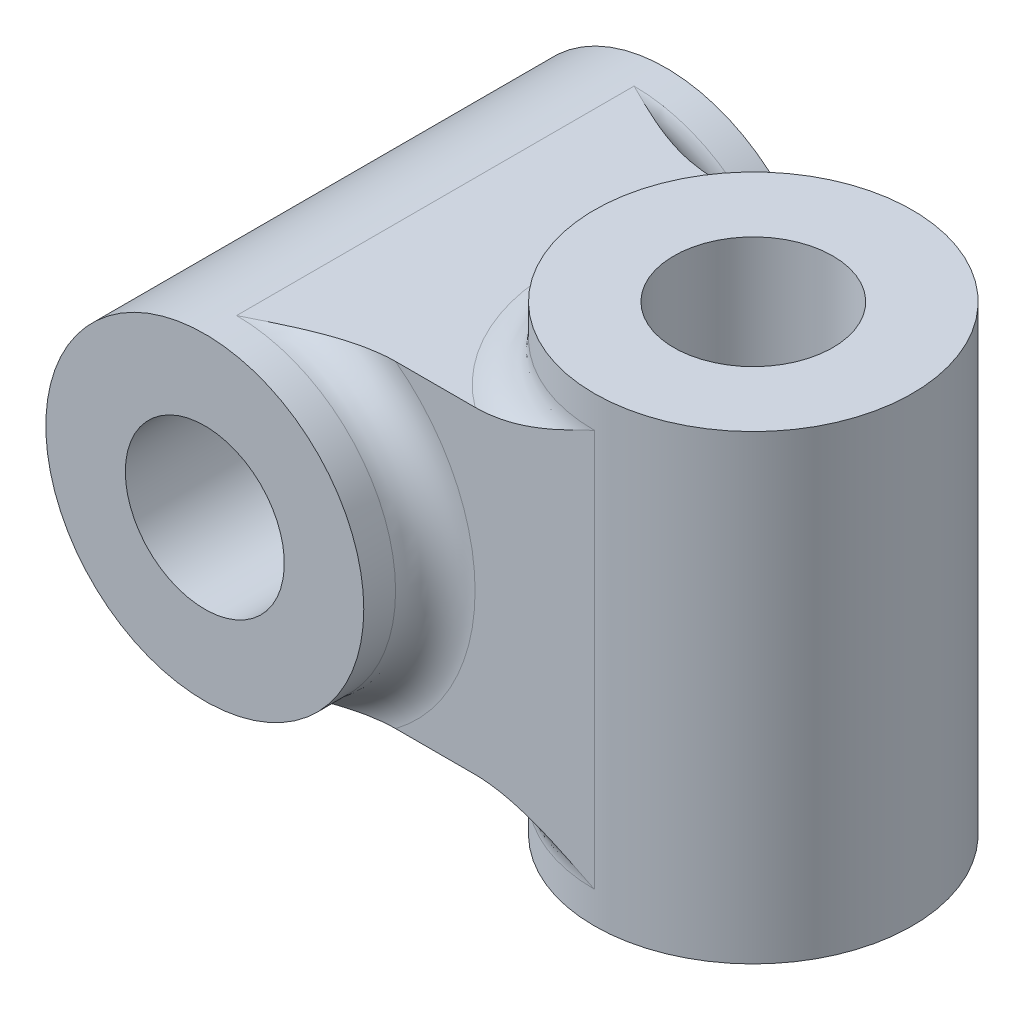
ISO-10303-21;
HEADER;
FILE_DESCRIPTION(('STEP AP214'),'2;1');
FILE_NAME('part.step','',(''),(''),'','','');
FILE_SCHEMA(('AUTOMOTIVE_DESIGN { 1 0 10303 214 1 1 1 1 }'));
ENDSEC;
DATA;
#1=APPLICATION_CONTEXT('core data for automotive mechanical design processes');
#2=APPLICATION_PROTOCOL_DEFINITION('international standard','automotive_design',2000,#1);
#3=PRODUCT_CONTEXT('',#1,'mechanical');
#4=PRODUCT('Part','Part','',(#3));
#5=PRODUCT_RELATED_PRODUCT_CATEGORY('part','',(#4));
#6=PRODUCT_DEFINITION_FORMATION('','',#4);
#7=PRODUCT_DEFINITION_CONTEXT('part definition',#1,'design');
#8=PRODUCT_DEFINITION('design','',#6,#7);
#9=PRODUCT_DEFINITION_SHAPE('','',#8);
#10=(LENGTH_UNIT() NAMED_UNIT(*) SI_UNIT(.MILLI.,.METRE.));
#11=(NAMED_UNIT(*) PLANE_ANGLE_UNIT() SI_UNIT($,.RADIAN.));
#12=(NAMED_UNIT(*) SI_UNIT($,.STERADIAN.) SOLID_ANGLE_UNIT());
#13=UNCERTAINTY_MEASURE_WITH_UNIT(LENGTH_MEASURE(1.E-05),#10,'distance_accuracy_value','');
#14=(GEOMETRIC_REPRESENTATION_CONTEXT(3) GLOBAL_UNCERTAINTY_ASSIGNED_CONTEXT((#13)) GLOBAL_UNIT_ASSIGNED_CONTEXT((#10,
#11,#12)) REPRESENTATION_CONTEXT('',''));
#15=CARTESIAN_POINT('',(0.,0.,0.));
#16=DIRECTION('',(0.,0.,1.));
#17=DIRECTION('',(1.,0.,0.));
#18=AXIS2_PLACEMENT_3D('',#15,#16,#17);
#19=CARTESIAN_POINT('',(0.,0.,58.));
#20=DIRECTION('',(0.,0.,1.));
#21=DIRECTION('',(1.,0.,0.));
#22=AXIS2_PLACEMENT_3D('',#19,#20,#21);
#23=PLANE('',#22);
#24=CARTESIAN_POINT('',(0.,0.,58.));
#25=DIRECTION('',(0.,0.,1.));
#26=DIRECTION('',(1.,0.,0.));
#27=AXIS2_PLACEMENT_3D('',#24,#25,#26);
#28=CIRCLE('',#27,20.);
#29=CARTESIAN_POINT('',(20.,0.,58.));
#30=VERTEX_POINT('',#29);
#31=EDGE_CURVE('E127',#30,#30,#28,.T.);
#32=ORIENTED_EDGE('',*,*,#31,.T.);
#33=EDGE_LOOP('',(#32));
#34=FACE_BOUND('',#33,.T.);
#35=CARTESIAN_POINT('',(0.,0.,58.));
#36=DIRECTION('',(0.,0.,1.));
#37=DIRECTION('',(1.,0.,0.));
#38=AXIS2_PLACEMENT_3D('',#35,#36,#37);
#39=CIRCLE('',#38,10.);
#40=CARTESIAN_POINT('',(-10.,0.,58.));
#41=VERTEX_POINT('',#40);
#42=EDGE_CURVE('E231',#41,#41,#39,.T.);
#43=ORIENTED_EDGE('',*,*,#42,.F.);
#44=EDGE_LOOP('',(#43));
#45=FACE_BOUND('',#44,.T.);
#46=ADVANCED_FACE('F41',(#34,#45),#23,.T.);
#47=CARTESIAN_POINT('',(0.,0.,0.));
#48=DIRECTION('',(0.,0.,1.));
#49=DIRECTION('',(1.,0.,0.));
#50=AXIS2_PLACEMENT_3D('',#47,#48,#49);
#51=PLANE('',#50);
#52=CARTESIAN_POINT('',(0.,0.,0.));
#53=DIRECTION('',(0.,0.,1.));
#54=DIRECTION('',(1.,0.,0.));
#55=AXIS2_PLACEMENT_3D('',#52,#53,#54);
#56=CIRCLE('',#55,20.);
#57=CARTESIAN_POINT('',(20.,0.,0.));
#58=VERTEX_POINT('',#57);
#59=EDGE_CURVE('E228',#58,#58,#56,.T.);
#60=ORIENTED_EDGE('',*,*,#59,.F.);
#61=EDGE_LOOP('',(#60));
#62=FACE_BOUND('',#61,.T.);
#63=CARTESIAN_POINT('',(0.,0.,0.));
#64=DIRECTION('',(0.,0.,1.));
#65=DIRECTION('',(1.,0.,0.));
#66=AXIS2_PLACEMENT_3D('',#63,#64,#65);
#67=CIRCLE('',#66,10.);
#68=CARTESIAN_POINT('',(-10.,0.,0.));
#69=VERTEX_POINT('',#68);
#70=EDGE_CURVE('E234',#69,#69,#67,.T.);
#71=ORIENTED_EDGE('',*,*,#70,.T.);
#72=EDGE_LOOP('',(#71));
#73=FACE_BOUND('',#72,.T.);
#74=ADVANCED_FACE('F279',(#62,#73),#51,.F.);
#75=CARTESIAN_POINT('',(0.,0.,58.));
#76=DIRECTION('',(0.,0.,-1.));
#77=DIRECTION('',(-1.,0.,0.));
#78=AXIS2_PLACEMENT_3D('',#75,#76,#77);
#79=CYLINDRICAL_SURFACE('',#78,20.);
#80=DIRECTION('',(0.,0.,-1.));
#81=VECTOR('',#80,1.);
#82=CARTESIAN_POINT('',(0.,20.,49.));
#83=LINE('',#82,#81);
#84=CARTESIAN_POINT('',(0.,20.,54.));
#85=VERTEX_POINT('',#84);
#86=CARTESIAN_POINT('',(0.,20.,3.99999999999999));
#87=VERTEX_POINT('',#86);
#88=EDGE_CURVE('E209',#85,#87,#83,.T.);
#89=ORIENTED_EDGE('',*,*,#88,.T.);
#90=CARTESIAN_POINT('',(0.,0.,3.99999999999998));
#91=DIRECTION('',(0.,0.,1.));
#92=DIRECTION('',(0.,-1.,0.));
#93=AXIS2_PLACEMENT_3D('',#90,#91,#92);
#94=CIRCLE('',#93,20.);
#95=CARTESIAN_POINT('',(0.,-20.,3.99999999999998));
#96=VERTEX_POINT('',#95);
#97=EDGE_CURVE('E216',#87,#96,#94,.F.);
#98=ORIENTED_EDGE('',*,*,#97,.T.);
#99=DIRECTION('',(0.,0.,-1.));
#100=VECTOR('',#99,1.);
#101=CARTESIAN_POINT('',(0.,-20.,49.));
#102=LINE('',#101,#100);
#103=CARTESIAN_POINT('',(0.,-20.,54.));
#104=VERTEX_POINT('',#103);
#105=EDGE_CURVE('E119',#104,#96,#102,.T.);
#106=ORIENTED_EDGE('',*,*,#105,.F.);
#107=CARTESIAN_POINT('',(0.,0.,54.));
#108=DIRECTION('',(0.,0.,1.));
#109=DIRECTION('',(1.,0.,0.));
#110=AXIS2_PLACEMENT_3D('',#107,#108,#109);
#111=CIRCLE('',#110,20.);
#112=EDGE_CURVE('E218',#104,#85,#111,.T.);
#113=ORIENTED_EDGE('',*,*,#112,.T.);
#114=EDGE_LOOP('',(#89,#98,#106,#113));
#115=FACE_BOUND('',#114,.T.);
#116=ORIENTED_EDGE('',*,*,#31,.F.);
#117=EDGE_LOOP('',(#116));
#118=FACE_BOUND('',#117,.T.);
#119=ORIENTED_EDGE('',*,*,#59,.T.);
#120=EDGE_LOOP('',(#119));
#121=FACE_BOUND('',#120,.T.);
#122=ADVANCED_FACE('F285',(#115,#118,#121),#79,.T.);
#123=CARTESIAN_POINT('',(0.,0.,58.));
#124=DIRECTION('',(0.,0.,-1.));
#125=DIRECTION('',(-1.,0.,0.));
#126=AXIS2_PLACEMENT_3D('',#123,#124,#125);
#127=CYLINDRICAL_SURFACE('',#126,10.);
#128=CARTESIAN_POINT('',(-10.,0.,58.));
#129=CARTESIAN_POINT('',(-10.,0.,57.3958333333333));
#130=CARTESIAN_POINT('',(-10.,0.,56.7916666666667));
#131=CARTESIAN_POINT('',(-10.,0.,55.5833333333333));
#132=CARTESIAN_POINT('',(-10.,0.,54.9791666666667));
#133=CARTESIAN_POINT('',(-10.,0.,53.7708333333333));
#134=CARTESIAN_POINT('',(-10.,0.,53.1666666666667));
#135=CARTESIAN_POINT('',(-10.,0.,51.9583333333333));
#136=CARTESIAN_POINT('',(-10.,0.,51.3541666666667));
#137=CARTESIAN_POINT('',(-10.,0.,50.1458333333333));
#138=CARTESIAN_POINT('',(-10.,0.,49.5416666666667));
#139=CARTESIAN_POINT('',(-10.,0.,48.3333333333333));
#140=CARTESIAN_POINT('',(-10.,0.,47.7291666666667));
#141=CARTESIAN_POINT('',(-10.,0.,46.5208333333333));
#142=CARTESIAN_POINT('',(-10.,0.,45.9166666666667));
#143=CARTESIAN_POINT('',(-10.,0.,44.7083333333333));
#144=CARTESIAN_POINT('',(-10.,0.,44.1041666666667));
#145=CARTESIAN_POINT('',(-10.,0.,42.8958333333333));
#146=CARTESIAN_POINT('',(-10.,0.,42.2916666666667));
#147=CARTESIAN_POINT('',(-10.,0.,41.0833333333333));
#148=CARTESIAN_POINT('',(-10.,0.,40.4791666666667));
#149=CARTESIAN_POINT('',(-10.,0.,39.2708333333333));
#150=CARTESIAN_POINT('',(-10.,0.,38.6666666666667));
#151=CARTESIAN_POINT('',(-10.,0.,37.4583333333333));
#152=CARTESIAN_POINT('',(-10.,0.,36.8541666666667));
#153=CARTESIAN_POINT('',(-10.,0.,35.6458333333333));
#154=CARTESIAN_POINT('',(-10.,0.,35.0416666666667));
#155=CARTESIAN_POINT('',(-10.,0.,33.8333333333333));
#156=CARTESIAN_POINT('',(-10.,0.,33.2291666666667));
#157=CARTESIAN_POINT('',(-10.,0.,32.0208333333333));
#158=CARTESIAN_POINT('',(-10.,0.,31.4166666666667));
#159=CARTESIAN_POINT('',(-10.,0.,30.2083333333333));
#160=CARTESIAN_POINT('',(-10.,0.,29.6041666666667));
#161=CARTESIAN_POINT('',(-10.,0.,28.3958333333333));
#162=CARTESIAN_POINT('',(-10.,0.,27.7916666666667));
#163=CARTESIAN_POINT('',(-10.,0.,26.5833333333333));
#164=CARTESIAN_POINT('',(-10.,0.,25.9791666666667));
#165=CARTESIAN_POINT('',(-10.,0.,24.7708333333333));
#166=CARTESIAN_POINT('',(-10.,0.,24.1666666666667));
#167=CARTESIAN_POINT('',(-10.,0.,22.9583333333333));
#168=CARTESIAN_POINT('',(-10.,0.,22.3541666666667));
#169=CARTESIAN_POINT('',(-10.,0.,21.1458333333333));
#170=CARTESIAN_POINT('',(-10.,0.,20.5416666666667));
#171=CARTESIAN_POINT('',(-10.,0.,19.3333333333333));
#172=CARTESIAN_POINT('',(-10.,0.,18.7291666666667));
#173=CARTESIAN_POINT('',(-10.,0.,17.5208333333333));
#174=CARTESIAN_POINT('',(-10.,0.,16.9166666666667));
#175=CARTESIAN_POINT('',(-10.,0.,15.7083333333333));
#176=CARTESIAN_POINT('',(-10.,0.,15.1041666666667));
#177=CARTESIAN_POINT('',(-10.,0.,13.8958333333333));
#178=CARTESIAN_POINT('',(-10.,0.,13.2916666666667));
#179=CARTESIAN_POINT('',(-10.,0.,12.0833333333333));
#180=CARTESIAN_POINT('',(-10.,0.,11.4791666666667));
#181=CARTESIAN_POINT('',(-10.,0.,10.2708333333333));
#182=CARTESIAN_POINT('',(-10.,0.,9.66666666666667));
#183=CARTESIAN_POINT('',(-10.,0.,8.45833333333333));
#184=CARTESIAN_POINT('',(-10.,0.,7.85416666666667));
#185=CARTESIAN_POINT('',(-10.,0.,6.64583333333333));
#186=CARTESIAN_POINT('',(-10.,0.,6.04166666666667));
#187=CARTESIAN_POINT('',(-10.,0.,4.83333333333333));
#188=CARTESIAN_POINT('',(-10.,0.,4.22916666666667));
#189=CARTESIAN_POINT('',(-10.,0.,3.02083333333334));
#190=CARTESIAN_POINT('',(-10.,0.,2.41666666666667));
#191=CARTESIAN_POINT('',(-10.,0.,1.20833333333333));
#192=CARTESIAN_POINT('',(-10.,0.,0.604166666666666));
#193=CARTESIAN_POINT('',(-10.,0.,0.));
#194=B_SPLINE_CURVE_WITH_KNOTS('',3,(#128,#129,#130,#131,#132,#133,#134,#135,#136,#137,#138,
#139,#140,#141,#142,#143,#144,#145,#146,#147,#148,#149,#150,#151,#152,#153,#154,#155,#156,#157,
#158,#159,#160,#161,#162,#163,#164,#165,#166,#167,#168,#169,#170,#171,#172,#173,#174,#175,#176,
#177,#178,#179,#180,#181,#182,#183,#184,#185,#186,#187,#188,#189,#190,#191,#192,#193),
.UNSPECIFIED.,.F.,.F.,(4,2,2,2,2,2,2,2,2,2,2,2,2,2,2,2,2,2,2,2,2,2,2,2,2,2,2,2,2,2,2,2,4),(0.,
1.81249999999999,3.625,5.4375,7.24999999999999,9.06249999999999,10.875,12.6875,14.5,16.3125,
18.125,19.9375,21.75,23.5625,25.375,27.1875,29.,30.8125,32.625,34.4375,36.25,38.0625,39.875,
41.6875,43.5,45.3125,47.125,48.9375,50.75,52.5625,54.375,56.1875,58.),.UNSPECIFIED.);
#195=EDGE_CURVE('BSEAM289',#41,#69,#194,.T.);
#196=ORIENTED_EDGE('',*,*,#42,.T.);
#197=ORIENTED_EDGE('',*,*,#70,.F.);
#198=ORIENTED_EDGE('',*,*,#195,.T.);
#199=ORIENTED_EDGE('',*,*,#195,.F.);
#200=EDGE_LOOP('',(#196,#198,#197,#199));
#201=FACE_BOUND('',#200,.T.);
#202=ADVANCED_FACE('F289',(#201),#127,.F.);
#203=CARTESIAN_POINT('',(40.,-20.,49.));
#204=DIRECTION('',(0.,0.,1.));
#205=DIRECTION('',(1.,0.,0.));
#206=AXIS2_PLACEMENT_3D('',#203,#204,#205);
#207=PLANE('',#206);
#208=DIRECTION('',(-1.,0.,0.));
#209=VECTOR('',#208,1.);
#210=CARTESIAN_POINT('',(40.,20.,49.));
#211=LINE('',#210,#209);
#212=CARTESIAN_POINT('',(25.,20.,49.));
#213=VERTEX_POINT('',#212);
#214=CARTESIAN_POINT('',(15.,20.,49.));
#215=VERTEX_POINT('',#214);
#216=EDGE_CURVE('E240',#213,#215,#211,.T.);
#217=ORIENTED_EDGE('',*,*,#216,.T.);
#218=CARTESIAN_POINT('',(0.,0.,49.));
#219=DIRECTION('',(0.,0.,1.));
#220=DIRECTION('',(1.,0.,0.));
#221=AXIS2_PLACEMENT_3D('',#218,#219,#220);
#222=CIRCLE('',#221,25.);
#223=CARTESIAN_POINT('',(15.,-20.,49.));
#224=VERTEX_POINT('',#223);
#225=EDGE_CURVE('E200',#215,#224,#222,.F.);
#226=ORIENTED_EDGE('',*,*,#225,.T.);
#227=DIRECTION('',(-1.,0.,0.));
#228=VECTOR('',#227,1.);
#229=CARTESIAN_POINT('',(40.,-20.,49.));
#230=LINE('',#229,#228);
#231=CARTESIAN_POINT('',(25.,-20.,49.));
#232=VERTEX_POINT('',#231);
#233=EDGE_CURVE('E237',#232,#224,#230,.T.);
#234=ORIENTED_EDGE('',*,*,#233,.F.);
#235=CARTESIAN_POINT('',(25.,-20.,49.));
#236=CARTESIAN_POINT('',(25.2651282089429,-20.0000248440085,49.));
#237=CARTESIAN_POINT('',(25.5301771044987,-20.007589934337,49.));
#238=CARTESIAN_POINT('',(26.0593880846254,-20.0364294351582,49.));
#239=CARTESIAN_POINT('',(26.3235505882963,-20.0576960351639,49.));
#240=CARTESIAN_POINT('',(26.8497890843893,-20.1124898408836,49.));
#241=CARTESIAN_POINT('',(27.1118689280912,-20.145980810748,49.));
#242=CARTESIAN_POINT('',(27.6343923106904,-20.2240499150372,49.));
#243=CARTESIAN_POINT('',(27.8948355873029,-20.2686297823921,49.));
#244=CARTESIAN_POINT('',(28.6664609884388,-20.4160433975464,49.));
#245=CARTESIAN_POINT('',(29.1749087512093,-20.5333381947335,49.));
#246=CARTESIAN_POINT('',(30.1837126611257,-20.7995778005164,49.));
#247=CARTESIAN_POINT('',(30.6840614597819,-20.9485497892506,49.));
#248=CARTESIAN_POINT('',(31.5605831445864,-21.2342047748402,49.));
#249=CARTESIAN_POINT('',(31.9384874405667,-21.3656435859749,49.));
#250=CARTESIAN_POINT('',(32.6897037488905,-21.6410837307938,49.));
#251=CARTESIAN_POINT('',(33.0630153714214,-21.7850861225578,49.));
#252=CARTESIAN_POINT('',(34.176661641421,-22.2325984737774,49.));
#253=CARTESIAN_POINT('',(34.9107431272673,-22.5516256043198,49.));
#254=CARTESIAN_POINT('',(36.3696325965115,-23.216950662706,49.));
#255=CARTESIAN_POINT('',(37.0943930587858,-23.5633504064254,49.));
#256=CARTESIAN_POINT('',(38.5376845637521,-24.2689287241272,49.));
#257=CARTESIAN_POINT('',(39.2562150092713,-24.6281085066499,49.));
#258=CARTESIAN_POINT('',(39.9831345201157,-24.9915672610964,49.));
#259=CARTESIAN_POINT('',(39.9915672605557,-24.9957836313378,49.));
#260=CARTESIAN_POINT('',(40.,-25.,49.));
#261=B_SPLINE_CURVE_WITH_KNOTS('',3,(#235,#236,#237,#238,#239,#240,#241,#242,#243,#244,#245,
#246,#247,#248,#249,#250,#251,#252,#253,#254,#255,#256,#257,#258,#259,#260),.UNSPECIFIED.,.F.,
.F.,(4,2,2,2,2,2,2,2,2,2,2,2,4),(0.,0.795162748327174,1.58987261810577,2.38224566558403,
3.17474261995516,4.73875375654246,6.30411232391702,7.50419539676254,8.70437963595933,
11.1046360659497,13.5142837354925,15.9241598813816,15.952444152629),.UNSPECIFIED.);
#262=CARTESIAN_POINT('',(40.,-25.,49.));
#263=VERTEX_POINT('',#262);
#264=EDGE_CURVE('E114',#232,#263,#261,.T.);
#265=ORIENTED_EDGE('',*,*,#264,.T.);
#266=DIRECTION('',(0.,1.,0.));
#267=VECTOR('',#266,1.);
#268=CARTESIAN_POINT('',(40.,-20.,49.));
#269=LINE('',#268,#267);
#270=CARTESIAN_POINT('',(40.,25.,49.));
#271=VERTEX_POINT('',#270);
#272=EDGE_CURVE('E109',#263,#271,#269,.T.);
#273=ORIENTED_EDGE('',*,*,#272,.T.);
#274=CARTESIAN_POINT('',(25.,20.,49.));
#275=CARTESIAN_POINT('',(25.2651282089429,20.0000248440085,49.));
#276=CARTESIAN_POINT('',(25.5301771044987,20.007589934337,49.));
#277=CARTESIAN_POINT('',(26.0593880846254,20.0364294351582,49.));
#278=CARTESIAN_POINT('',(26.3235505882963,20.0576960351639,49.));
#279=CARTESIAN_POINT('',(26.8497890843893,20.1124898408836,49.));
#280=CARTESIAN_POINT('',(27.1118689280912,20.145980810748,49.));
#281=CARTESIAN_POINT('',(27.6343923106904,20.2240499150372,49.));
#282=CARTESIAN_POINT('',(27.8948355873029,20.2686297823921,49.));
#283=CARTESIAN_POINT('',(28.6664609884388,20.4160433975464,49.));
#284=CARTESIAN_POINT('',(29.1749087512093,20.5333381947335,49.));
#285=CARTESIAN_POINT('',(30.1837126611257,20.7995778005164,49.));
#286=CARTESIAN_POINT('',(30.6840614597819,20.9485497892506,49.));
#287=CARTESIAN_POINT('',(31.5605831445864,21.2342047748402,49.));
#288=CARTESIAN_POINT('',(31.9384874405667,21.3656435859748,49.));
#289=CARTESIAN_POINT('',(32.6897037488905,21.6410837307938,49.));
#290=CARTESIAN_POINT('',(33.0630153714214,21.7850861225578,49.));
#291=CARTESIAN_POINT('',(34.176661641421,22.2325984737774,49.));
#292=CARTESIAN_POINT('',(34.9107431272673,22.5516256043198,49.));
#293=CARTESIAN_POINT('',(36.3696325965115,23.216950662706,49.));
#294=CARTESIAN_POINT('',(37.0943930587858,23.5633504064254,49.));
#295=CARTESIAN_POINT('',(38.5376845637521,24.2689287241272,49.));
#296=CARTESIAN_POINT('',(39.2562150092713,24.6281085066499,49.));
#297=CARTESIAN_POINT('',(39.9831345201157,24.9915672610964,49.));
#298=CARTESIAN_POINT('',(39.9915672605557,24.9957836313378,49.));
#299=CARTESIAN_POINT('',(40.,25.,49.));
#300=B_SPLINE_CURVE_WITH_KNOTS('',3,(#274,#275,#276,#277,#278,#279,#280,#281,#282,#283,#284,
#285,#286,#287,#288,#289,#290,#291,#292,#293,#294,#295,#296,#297,#298,#299),.UNSPECIFIED.,.F.,
.F.,(4,2,2,2,2,2,2,2,2,2,2,2,4),(0.,0.795162748327174,1.58987261810577,2.38224566558403,
3.17474261995516,4.73875375654246,6.30411232391702,7.50419539676255,8.70437963595933,
11.1046360659497,13.5142837354925,15.9241598813816,15.952444152629),.UNSPECIFIED.);
#301=EDGE_CURVE('E68',#271,#213,#300,.F.);
#302=ORIENTED_EDGE('',*,*,#301,.T.);
#303=EDGE_LOOP('',(#217,#226,#234,#265,#273,#302));
#304=FACE_BOUND('',#303,.T.);
#305=ADVANCED_FACE('F111',(#304),#207,.T.);
#306=CARTESIAN_POINT('',(40.,-20.,49.));
#307=DIRECTION('',(0.,1.,0.));
#308=DIRECTION('',(0.,0.,1.));
#309=AXIS2_PLACEMENT_3D('',#306,#307,#308);
#310=PLANE('',#309);
#311=DIRECTION('',(-1.,0.,0.));
#312=VECTOR('',#311,1.);
#313=CARTESIAN_POINT('',(40.,-20.,8.99999999999998));
#314=LINE('',#313,#312);
#315=CARTESIAN_POINT('',(25.,-20.,8.99999999999998));
#316=VERTEX_POINT('',#315);
#317=CARTESIAN_POINT('',(15.,-20.,8.99999999999998));
#318=VERTEX_POINT('',#317);
#319=EDGE_CURVE('E243',#316,#318,#314,.T.);
#320=ORIENTED_EDGE('',*,*,#319,.F.);
#321=CARTESIAN_POINT('',(40.,-20.,29.));
#322=DIRECTION('',(0.,1.,0.));
#323=DIRECTION('',(0.,0.,1.));
#324=AXIS2_PLACEMENT_3D('',#321,#322,#323);
#325=CIRCLE('',#324,25.);
#326=EDGE_CURVE('E225',#316,#232,#325,.T.);
#327=ORIENTED_EDGE('',*,*,#326,.T.);
#328=ORIENTED_EDGE('',*,*,#233,.T.);
#329=CARTESIAN_POINT('',(15.,-20.,49.));
#330=CARTESIAN_POINT('',(14.734871791058,-20.,49.0000248440085));
#331=CARTESIAN_POINT('',(14.4698228955031,-20.,49.007589934337));
#332=CARTESIAN_POINT('',(13.9406119153781,-20.,49.036429435158));
#333=CARTESIAN_POINT('',(13.6764494117081,-20.,49.0576960351635));
#334=CARTESIAN_POINT('',(13.1502109156166,-20.,49.1124898408829));
#335=CARTESIAN_POINT('',(12.8881310719155,-20.,49.1459808107472));
#336=CARTESIAN_POINT('',(12.3656076893176,-20.,49.2240499150359));
#337=CARTESIAN_POINT('',(12.1051644127057,-20.,49.2686297823906));
#338=CARTESIAN_POINT('',(11.3335390115688,-20.,49.4160433975447));
#339=CARTESIAN_POINT('',(10.8250912487966,-20.,49.533338194732));
#340=CARTESIAN_POINT('',(9.81628733887715,-20.,49.7995778005156));
#341=CARTESIAN_POINT('',(9.31593854021946,-20.,49.9485497892502));
#342=CARTESIAN_POINT('',(8.43941685541347,-20.,50.2342047748402));
#343=CARTESIAN_POINT('',(8.06151255943296,-20.,50.3656435859749));
#344=CARTESIAN_POINT('',(7.31029625110899,-20.,50.641083730794));
#345=CARTESIAN_POINT('',(6.9369846285781,-20.,50.7850861225583));
#346=CARTESIAN_POINT('',(5.82333835857747,-20.,51.2325984737775));
#347=CARTESIAN_POINT('',(5.08925687272968,-20.,51.5516256043185));
#348=CARTESIAN_POINT('',(3.63036740348735,-20.,52.2169506627092));
#349=CARTESIAN_POINT('',(2.90560694121646,-20.,52.5633504064345));
#350=CARTESIAN_POINT('',(1.46231543624279,-20.,53.2689287241194));
#351=CARTESIAN_POINT('',(0.74378499071274,-20.,53.6281085066193));
#352=CARTESIAN_POINT('',(0.0168654798839559,-20.,53.9915672610957));
#353=CARTESIAN_POINT('',(0.00843273944410271,-20.,53.9957836313375));
#354=CARTESIAN_POINT('',(0.,-20.,54.));
#355=B_SPLINE_CURVE_WITH_KNOTS('',3,(#329,#330,#331,#332,#333,#334,#335,#336,#337,#338,#339,
#340,#341,#342,#343,#344,#345,#346,#347,#348,#349,#350,#351,#352,#353,#354),.UNSPECIFIED.,.F.,
.F.,(4,2,2,2,2,2,2,2,2,2,2,2,4),(0.,0.795162748324529,1.58987261810048,2.38224566557666,
3.17474261994572,4.73875375653805,6.30411232391702,7.50419539676299,8.70437963596004,
11.1046360659524,13.5142837354942,15.9241598813816,15.952444152629),.UNSPECIFIED.);
#356=EDGE_CURVE('E12',#224,#104,#355,.T.);
#357=ORIENTED_EDGE('',*,*,#356,.T.);
#358=ORIENTED_EDGE('',*,*,#105,.T.);
#359=CARTESIAN_POINT('',(15.,-20.,8.99999999999998));
#360=CARTESIAN_POINT('',(14.7348717910581,-20.,8.99997515599151));
#361=CARTESIAN_POINT('',(14.4698228955031,-20.,8.99241006566299));
#362=CARTESIAN_POINT('',(13.9406119153783,-20.,8.96357056484199));
#363=CARTESIAN_POINT('',(13.6764494117083,-20.,8.94230396483651));
#364=CARTESIAN_POINT('',(13.1502109156169,-20.,8.88751015911715));
#365=CARTESIAN_POINT('',(12.8881310719158,-20.,8.85401918925287));
#366=CARTESIAN_POINT('',(12.3656076893179,-20.,8.77595008496414));
#367=CARTESIAN_POINT('',(12.1051644127061,-20.,8.73137021760948));
#368=CARTESIAN_POINT('',(11.3335390115692,-20.,8.58395660245538));
#369=CARTESIAN_POINT('',(10.8250912487969,-20.,8.46666180526804));
#370=CARTESIAN_POINT('',(9.81628733887729,-20.,8.20042219948441));
#371=CARTESIAN_POINT('',(9.31593854021953,-20.,8.0514502107498));
#372=CARTESIAN_POINT('',(8.43941685541347,-20.,7.76579522515975));
#373=CARTESIAN_POINT('',(8.06151255943294,-20.,7.63435641402509));
#374=CARTESIAN_POINT('',(7.31029625110897,-20.,7.35891626920594));
#375=CARTESIAN_POINT('',(6.93698462857808,-20.,7.2149138774417));
#376=CARTESIAN_POINT('',(5.8233383585774,-20.,6.76740152622248));
#377=CARTESIAN_POINT('',(5.08925687272954,-20.,6.4483743956816));
#378=CARTESIAN_POINT('',(3.6303674034873,-20.,5.78304933729061));
#379=CARTESIAN_POINT('',(2.90560694121658,-20.,5.43664959356502));
#380=CARTESIAN_POINT('',(1.46231543624254,-20.,4.73107127588095));
#381=CARTESIAN_POINT('',(0.743784990711952,-20.,4.37189149338223));
#382=CARTESIAN_POINT('',(0.016865479883942,-20.,4.00843273890429));
#383=CARTESIAN_POINT('',(0.00843273944409571,-20.,4.00421636866253));
#384=CARTESIAN_POINT('',(0.,-20.,3.99999999999998));
#385=B_SPLINE_CURVE_WITH_KNOTS('',3,(#359,#360,#361,#362,#363,#364,#365,#366,#367,#368,#369,
#370,#371,#372,#373,#374,#375,#376,#377,#378,#379,#380,#381,#382,#383,#384),.UNSPECIFIED.,.F.,
.F.,(4,2,2,2,2,2,2,2,2,2,2,2,4),(0.,0.795162748324397,1.58987261810021,2.3822456655763,
3.17474261994525,4.73875375653783,6.30411232391702,7.50419539676301,8.70437963596008,
11.1046360659526,13.5142837354943,15.9241598813816,15.952444152629),.UNSPECIFIED.);
#386=EDGE_CURVE('E135',#96,#318,#385,.F.);
#387=ORIENTED_EDGE('',*,*,#386,.T.);
#388=EDGE_LOOP('',(#320,#327,#328,#357,#358,#387));
#389=FACE_BOUND('',#388,.T.);
#390=ADVANCED_FACE('F179',(#389),#310,.F.);
#391=CARTESIAN_POINT('',(40.,-20.,8.99999999999998));
#392=DIRECTION('',(0.,0.,1.));
#393=DIRECTION('',(0.,-1.,0.));
#394=AXIS2_PLACEMENT_3D('',#391,#392,#393);
#395=PLANE('',#394);
#396=ORIENTED_EDGE('',*,*,#319,.T.);
#397=CARTESIAN_POINT('',(0.,0.,8.99999999999998));
#398=DIRECTION('',(0.,0.,1.));
#399=DIRECTION('',(0.,-1.,0.));
#400=AXIS2_PLACEMENT_3D('',#397,#398,#399);
#401=CIRCLE('',#400,25.);
#402=CARTESIAN_POINT('',(15.,20.,8.99999999999998));
#403=VERTEX_POINT('',#402);
#404=EDGE_CURVE('E221',#318,#403,#401,.T.);
#405=ORIENTED_EDGE('',*,*,#404,.T.);
#406=DIRECTION('',(-1.,0.,0.));
#407=VECTOR('',#406,1.);
#408=CARTESIAN_POINT('',(40.,20.,8.99999999999998));
#409=LINE('',#408,#407);
#410=CARTESIAN_POINT('',(25.,20.,8.99999999999998));
#411=VERTEX_POINT('',#410);
#412=EDGE_CURVE('E211',#411,#403,#409,.T.);
#413=ORIENTED_EDGE('',*,*,#412,.F.);
#414=CARTESIAN_POINT('',(25.,20.,8.99999999999998));
#415=CARTESIAN_POINT('',(25.265128208942,20.0000248440085,8.99999999999998));
#416=CARTESIAN_POINT('',(25.5301771044969,20.007589934337,8.99999999999998));
#417=CARTESIAN_POINT('',(26.0593880846219,20.036429435158,8.99999999999998));
#418=CARTESIAN_POINT('',(26.3235505882919,20.0576960351635,8.99999999999998));
#419=CARTESIAN_POINT('',(26.8497890843833,20.1124898408829,8.99999999999998));
#420=CARTESIAN_POINT('',(27.1118689280845,20.1459808107471,8.99999999999998));
#421=CARTESIAN_POINT('',(27.6343923106824,20.2240499150359,8.99999999999998));
#422=CARTESIAN_POINT('',(27.8948355872942,20.2686297823906,8.99999999999998));
#423=CARTESIAN_POINT('',(28.6664609884311,20.4160433975447,8.99999999999998));
#424=CARTESIAN_POINT('',(29.1749087512034,20.533338194732,8.99999999999998));
#425=CARTESIAN_POINT('',(30.1837126611228,20.7995778005156,8.99999999999998));
#426=CARTESIAN_POINT('',(30.6840614597805,20.9485497892502,8.99999999999998));
#427=CARTESIAN_POINT('',(31.5605831445865,21.2342047748402,8.99999999999998));
#428=CARTESIAN_POINT('',(31.9384874405671,21.3656435859749,8.99999999999998));
#429=CARTESIAN_POINT('',(32.689703748891,21.641083730794,8.99999999999998));
#430=CARTESIAN_POINT('',(33.0630153714219,21.7850861225583,8.99999999999998));
#431=CARTESIAN_POINT('',(34.1766616414226,22.2325984737775,8.99999999999998));
#432=CARTESIAN_POINT('',(34.9107431272704,22.5516256043184,8.99999999999998));
#433=CARTESIAN_POINT('',(36.3696325965127,23.2169506627093,8.99999999999998));
#434=CARTESIAN_POINT('',(37.0943930587835,23.5633504064346,8.99999999999998));
#435=CARTESIAN_POINT('',(38.5376845637573,24.2689287241193,8.99999999999998));
#436=CARTESIAN_POINT('',(39.2562150092874,24.6281085066189,8.99999999999998));
#437=CARTESIAN_POINT('',(39.983134520116,24.9915672610957,8.99999999999998));
#438=CARTESIAN_POINT('',(39.9915672605559,24.9957836313375,8.99999999999998));
#439=CARTESIAN_POINT('',(40.,25.,8.99999999999998));
#440=B_SPLINE_CURVE_WITH_KNOTS('',3,(#414,#415,#416,#417,#418,#419,#420,#421,#422,#423,#424,
#425,#426,#427,#428,#429,#430,#431,#432,#433,#434,#435,#436,#437,#438,#439),.UNSPECIFIED.,.F.,
.F.,(4,2,2,2,2,2,2,2,2,2,2,2,4),(0.,0.795162748324496,1.58987261810041,2.38224566557658,
3.17474261994561,4.738753756538,6.30411232391703,7.50419539676301,8.70437963596006,
11.1046360659525,13.5142837354942,15.9241598813816,15.952444152629),.UNSPECIFIED.);
#441=CARTESIAN_POINT('',(40.,25.,8.99999999999998));
#442=VERTEX_POINT('',#441);
#443=EDGE_CURVE('E133',#411,#442,#440,.T.);
#444=ORIENTED_EDGE('',*,*,#443,.T.);
#445=DIRECTION('',(0.,1.,0.));
#446=VECTOR('',#445,1.);
#447=CARTESIAN_POINT('',(40.,-20.,8.99999999999998));
#448=LINE('',#447,#446);
#449=CARTESIAN_POINT('',(40.,-25.,8.99999999999998));
#450=VERTEX_POINT('',#449);
#451=EDGE_CURVE('E118',#450,#442,#448,.T.);
#452=ORIENTED_EDGE('',*,*,#451,.F.);
#453=CARTESIAN_POINT('',(25.,-20.,8.99999999999998));
#454=CARTESIAN_POINT('',(25.2651282089405,-20.0000248440085,8.99999999999998));
#455=CARTESIAN_POINT('',(25.5301771044939,-20.0075899343369,8.99999999999998));
#456=CARTESIAN_POINT('',(26.0593880846159,-20.0364294351576,8.99999999999998));
#457=CARTESIAN_POINT('',(26.3235505882844,-20.0576960351628,8.99999999999998));
#458=CARTESIAN_POINT('',(26.8497890843731,-20.1124898408817,8.99999999999998));
#459=CARTESIAN_POINT('',(27.1118689280732,-20.1459808107456,8.99999999999998));
#460=CARTESIAN_POINT('',(27.6343923106688,-20.2240499150337,8.99999999999998));
#461=CARTESIAN_POINT('',(27.8948355872795,-20.268629782388,8.99999999999998));
#462=CARTESIAN_POINT('',(28.6664609884182,-20.4160433975418,8.99999999999998));
#463=CARTESIAN_POINT('',(29.1749087511933,-20.5333381947295,8.99999999999998));
#464=CARTESIAN_POINT('',(30.183712661118,-20.7995778005142,8.99999999999998));
#465=CARTESIAN_POINT('',(30.6840614597781,-20.9485497892495,8.99999999999998));
#466=CARTESIAN_POINT('',(31.5605831445868,-21.2342047748403,8.99999999999998));
#467=CARTESIAN_POINT('',(31.9384874405676,-21.365643585975,8.99999999999998));
#468=CARTESIAN_POINT('',(32.6897037488918,-21.6410837307944,8.99999999999998));
#469=CARTESIAN_POINT('',(33.0630153714227,-21.785086122559,8.99999999999998));
#470=CARTESIAN_POINT('',(34.176661641425,-22.2325984737777,8.99999999999998));
#471=CARTESIAN_POINT('',(34.9107431272754,-22.5516256043162,8.99999999999998));
#472=CARTESIAN_POINT('',(36.3696325965144,-23.2169506627146,8.99999999999998));
#473=CARTESIAN_POINT('',(37.0943930587795,-23.5633504064502,8.99999999999999));
#474=CARTESIAN_POINT('',(38.5376845637659,-24.268928724106,8.99999999999997));
#475=CARTESIAN_POINT('',(39.2562150093145,-24.6281085065665,8.99999999999993));
#476=CARTESIAN_POINT('',(39.9831345201166,-24.9915672610944,8.99999999999998));
#477=CARTESIAN_POINT('',(39.9915672605562,-24.9957836313368,8.99999999999998));
#478=CARTESIAN_POINT('',(40.,-25.,8.99999999999998));
#479=B_SPLINE_CURVE_WITH_KNOTS('',3,(#453,#454,#455,#456,#457,#458,#459,#460,#461,#462,#463,
#464,#465,#466,#467,#468,#469,#470,#471,#472,#473,#474,#475,#476,#477,#478),.UNSPECIFIED.,.F.,
.F.,(4,2,2,2,2,2,2,2,2,2,2,2,4),(0.,0.795162748319988,1.58987261809139,2.38224566556401,
3.1747426199295,4.73875375653048,6.30411232391703,7.50419539676373,8.70437963596123,
11.1046360659571,13.5142837354969,15.9241598813814,15.952444152629),.UNSPECIFIED.);
#480=EDGE_CURVE('E194',#450,#316,#479,.F.);
#481=ORIENTED_EDGE('',*,*,#480,.T.);
#482=EDGE_LOOP('',(#396,#405,#413,#444,#452,#481));
#483=FACE_BOUND('',#482,.T.);
#484=ADVANCED_FACE('F183',(#483),#395,.F.);
#485=CARTESIAN_POINT('',(40.,20.,49.));
#486=DIRECTION('',(0.,1.,0.));
#487=DIRECTION('',(0.,0.,1.));
#488=AXIS2_PLACEMENT_3D('',#485,#486,#487);
#489=PLANE('',#488);
#490=ORIENTED_EDGE('',*,*,#216,.F.);
#491=CARTESIAN_POINT('',(40.,20.,29.));
#492=DIRECTION('',(0.,1.,0.));
#493=DIRECTION('',(0.,0.,1.));
#494=AXIS2_PLACEMENT_3D('',#491,#492,#493);
#495=CIRCLE('',#494,25.);
#496=EDGE_CURVE('E132',#213,#411,#495,.F.);
#497=ORIENTED_EDGE('',*,*,#496,.T.);
#498=ORIENTED_EDGE('',*,*,#412,.T.);
#499=CARTESIAN_POINT('',(15.,20.,8.99999999999998));
#500=CARTESIAN_POINT('',(14.7348717910581,20.,8.99997515599152));
#501=CARTESIAN_POINT('',(14.4698228955032,20.,8.992410065663));
#502=CARTESIAN_POINT('',(13.9406119153783,20.,8.963570564842));
#503=CARTESIAN_POINT('',(13.6764494117083,20.,8.94230396483652));
#504=CARTESIAN_POINT('',(13.150210915617,20.,8.88751015911716));
#505=CARTESIAN_POINT('',(12.8881310719159,20.,8.85401918925288));
#506=CARTESIAN_POINT('',(12.3656076893181,20.,8.77595008496417));
#507=CARTESIAN_POINT('',(12.1051644127063,20.,8.73137021760951));
#508=CARTESIAN_POINT('',(11.3335390115693,20.,8.58395660245541));
#509=CARTESIAN_POINT('',(10.825091248797,20.,8.46666180526806));
#510=CARTESIAN_POINT('',(9.81628733887733,20.,8.20042219948443));
#511=CARTESIAN_POINT('',(9.31593854021955,20.,8.05145021074981));
#512=CARTESIAN_POINT('',(8.43941685541347,20.,7.76579522515976));
#513=CARTESIAN_POINT('',(8.06151255943294,20.,7.63435641402509));
#514=CARTESIAN_POINT('',(7.31029625110897,20.,7.35891626920594));
#515=CARTESIAN_POINT('',(6.93698462857807,20.,7.2149138774417));
#516=CARTESIAN_POINT('',(5.82333835857738,20.,6.76740152622248));
#517=CARTESIAN_POINT('',(5.0892568727295,20.,6.44837439568163));
#518=CARTESIAN_POINT('',(3.63036740348729,20.,5.78304933729057));
#519=CARTESIAN_POINT('',(2.90560694121662,20.,5.43664959356489));
#520=CARTESIAN_POINT('',(1.46231543624247,20.,4.73107127588107));
#521=CARTESIAN_POINT('',(0.743784990711718,20.,4.37189149338269));
#522=CARTESIAN_POINT('',(0.0168654798839386,20.,4.00843273890431));
#523=CARTESIAN_POINT('',(0.00843273944409399,20.,4.00421636866254));
#524=CARTESIAN_POINT('',(0.,20.,3.99999999999998));
#525=B_SPLINE_CURVE_WITH_KNOTS('',3,(#499,#500,#501,#502,#503,#504,#505,#506,#507,#508,#509,
#510,#511,#512,#513,#514,#515,#516,#517,#518,#519,#520,#521,#522,#523,#524),.UNSPECIFIED.,.F.,
.F.,(4,2,2,2,2,2,2,2,2,2,2,2,4),(0.,0.795162748324356,1.58987261810013,2.38224566557619,
3.17474261994511,4.73875375653776,6.30411232391702,7.50419539676301,8.70437963596008,
11.1046360659526,13.5142837354943,15.9241598813816,15.952444152629),.UNSPECIFIED.);
#526=EDGE_CURVE('E169',#403,#87,#525,.T.);
#527=ORIENTED_EDGE('',*,*,#526,.T.);
#528=ORIENTED_EDGE('',*,*,#88,.F.);
#529=CARTESIAN_POINT('',(15.,20.,49.));
#530=CARTESIAN_POINT('',(14.734871791058,20.,49.0000248440085));
#531=CARTESIAN_POINT('',(14.4698228955031,20.,49.007589934337));
#532=CARTESIAN_POINT('',(13.9406119153781,20.,49.036429435158));
#533=CARTESIAN_POINT('',(13.6764494117081,20.,49.0576960351635));
#534=CARTESIAN_POINT('',(13.1502109156166,20.,49.1124898408829));
#535=CARTESIAN_POINT('',(12.8881310719155,20.,49.1459808107472));
#536=CARTESIAN_POINT('',(12.3656076893176,20.,49.2240499150359));
#537=CARTESIAN_POINT('',(12.1051644127057,20.,49.2686297823906));
#538=CARTESIAN_POINT('',(11.3335390115688,20.,49.4160433975447));
#539=CARTESIAN_POINT('',(10.8250912487966,20.,49.533338194732));
#540=CARTESIAN_POINT('',(9.81628733887715,20.,49.7995778005156));
#541=CARTESIAN_POINT('',(9.31593854021946,20.,49.9485497892502));
#542=CARTESIAN_POINT('',(8.43941685541347,20.,50.2342047748402));
#543=CARTESIAN_POINT('',(8.06151255943296,20.,50.3656435859749));
#544=CARTESIAN_POINT('',(7.31029625110899,20.,50.641083730794));
#545=CARTESIAN_POINT('',(6.9369846285781,20.,50.7850861225583));
#546=CARTESIAN_POINT('',(5.82333835857747,20.,51.2325984737775));
#547=CARTESIAN_POINT('',(5.08925687272968,20.,51.5516256043185));
#548=CARTESIAN_POINT('',(3.63036740348735,20.,52.2169506627092));
#549=CARTESIAN_POINT('',(2.90560694121646,20.,52.5633504064345));
#550=CARTESIAN_POINT('',(1.46231543624279,20.,53.2689287241194));
#551=CARTESIAN_POINT('',(0.74378499071274,20.,53.6281085066193));
#552=CARTESIAN_POINT('',(0.0168654798839559,20.,53.9915672610957));
#553=CARTESIAN_POINT('',(0.00843273944410271,20.,53.9957836313375));
#554=CARTESIAN_POINT('',(0.,20.,54.));
#555=B_SPLINE_CURVE_WITH_KNOTS('',3,(#529,#530,#531,#532,#533,#534,#535,#536,#537,#538,#539,
#540,#541,#542,#543,#544,#545,#546,#547,#548,#549,#550,#551,#552,#553,#554),.UNSPECIFIED.,.F.,
.F.,(4,2,2,2,2,2,2,2,2,2,2,2,4),(0.,0.795162748324529,1.58987261810048,2.38224566557666,
3.17474261994572,4.73875375653805,6.30411232391702,7.50419539676299,8.70437963596004,
11.1046360659524,13.5142837354942,15.9241598813816,15.952444152629),.UNSPECIFIED.);
#556=EDGE_CURVE('E55',#85,#215,#555,.F.);
#557=ORIENTED_EDGE('',*,*,#556,.T.);
#558=EDGE_LOOP('',(#490,#497,#498,#527,#528,#557));
#559=FACE_BOUND('',#558,.T.);
#560=ADVANCED_FACE('F189',(#559),#489,.T.);
#561=CARTESIAN_POINT('',(40.,29.,29.));
#562=DIRECTION('',(0.,-1.,0.));
#563=DIRECTION('',(0.,0.,-1.));
#564=AXIS2_PLACEMENT_3D('',#561,#562,#563);
#565=CYLINDRICAL_SURFACE('',#564,20.);
#566=CARTESIAN_POINT('',(40.,29.,29.));
#567=DIRECTION('',(0.,1.,0.));
#568=DIRECTION('',(0.,0.,1.));
#569=AXIS2_PLACEMENT_3D('',#566,#567,#568);
#570=CIRCLE('',#569,20.);
#571=CARTESIAN_POINT('',(40.,29.,49.));
#572=VERTEX_POINT('',#571);
#573=EDGE_CURVE('E250',#572,#572,#570,.T.);
#574=ORIENTED_EDGE('',*,*,#573,.F.);
#575=EDGE_LOOP('',(#574));
#576=FACE_BOUND('',#575,.T.);
#577=CARTESIAN_POINT('',(40.,-29.,29.));
#578=DIRECTION('',(0.,1.,0.));
#579=DIRECTION('',(0.,0.,1.));
#580=AXIS2_PLACEMENT_3D('',#577,#578,#579);
#581=CIRCLE('',#580,20.);
#582=CARTESIAN_POINT('',(40.,-29.,49.));
#583=VERTEX_POINT('',#582);
#584=EDGE_CURVE('E252',#583,#583,#581,.T.);
#585=ORIENTED_EDGE('',*,*,#584,.T.);
#586=EDGE_LOOP('',(#585));
#587=FACE_BOUND('',#586,.T.);
#588=CARTESIAN_POINT('',(40.,-25.,29.));
#589=DIRECTION('',(0.,1.,0.));
#590=DIRECTION('',(0.,0.,1.));
#591=AXIS2_PLACEMENT_3D('',#588,#589,#590);
#592=CIRCLE('',#591,20.);
#593=EDGE_CURVE('E126',#263,#450,#592,.F.);
#594=ORIENTED_EDGE('',*,*,#593,.T.);
#595=ORIENTED_EDGE('',*,*,#451,.T.);
#596=CARTESIAN_POINT('',(40.,25.,29.));
#597=DIRECTION('',(0.,1.,0.));
#598=DIRECTION('',(0.,0.,1.));
#599=AXIS2_PLACEMENT_3D('',#596,#597,#598);
#600=CIRCLE('',#599,20.);
#601=EDGE_CURVE('E122',#442,#271,#600,.T.);
#602=ORIENTED_EDGE('',*,*,#601,.T.);
#603=ORIENTED_EDGE('',*,*,#272,.F.);
#604=EDGE_LOOP('',(#594,#595,#602,#603));
#605=FACE_BOUND('',#604,.T.);
#606=ADVANCED_FACE('F123',(#576,#587,#605),#565,.T.);
#607=CARTESIAN_POINT('',(40.,29.,29.));
#608=DIRECTION('',(0.,-1.,0.));
#609=DIRECTION('',(0.,0.,-1.));
#610=AXIS2_PLACEMENT_3D('',#607,#608,#609);
#611=CYLINDRICAL_SURFACE('',#610,10.);
#612=CARTESIAN_POINT('',(40.,-29.,29.));
#613=DIRECTION('',(0.,1.,0.));
#614=DIRECTION('',(0.,0.,1.));
#615=AXIS2_PLACEMENT_3D('',#612,#613,#614);
#616=CIRCLE('',#615,10.);
#617=CARTESIAN_POINT('',(40.,-29.,19.));
#618=VERTEX_POINT('',#617);
#619=EDGE_CURVE('E258',#618,#618,#616,.T.);
#620=CARTESIAN_POINT('',(40.,29.,29.));
#621=DIRECTION('',(0.,1.,0.));
#622=DIRECTION('',(0.,0.,1.));
#623=AXIS2_PLACEMENT_3D('',#620,#621,#622);
#624=CIRCLE('',#623,10.);
#625=CARTESIAN_POINT('',(40.,29.,19.));
#626=VERTEX_POINT('',#625);
#627=EDGE_CURVE('E255',#626,#626,#624,.T.);
#628=CARTESIAN_POINT('',(40.,-29.,19.));
#629=CARTESIAN_POINT('',(40.,-28.3958333333333,19.));
#630=CARTESIAN_POINT('',(40.,-27.7916666666667,19.));
#631=CARTESIAN_POINT('',(40.,-26.5833333333333,19.));
#632=CARTESIAN_POINT('',(40.,-25.9791666666667,19.));
#633=CARTESIAN_POINT('',(40.,-24.7708333333333,19.));
#634=CARTESIAN_POINT('',(40.,-24.1666666666667,19.));
#635=CARTESIAN_POINT('',(40.,-22.9583333333333,19.));
#636=CARTESIAN_POINT('',(40.,-22.3541666666667,19.));
#637=CARTESIAN_POINT('',(40.,-21.1458333333333,19.));
#638=CARTESIAN_POINT('',(40.,-20.5416666666667,19.));
#639=CARTESIAN_POINT('',(40.,-19.3333333333333,19.));
#640=CARTESIAN_POINT('',(40.,-18.7291666666667,19.));
#641=CARTESIAN_POINT('',(40.,-17.5208333333333,19.));
#642=CARTESIAN_POINT('',(40.,-16.9166666666667,19.));
#643=CARTESIAN_POINT('',(40.,-15.7083333333333,19.));
#644=CARTESIAN_POINT('',(40.,-15.1041666666667,19.));
#645=CARTESIAN_POINT('',(40.,-13.8958333333333,19.));
#646=CARTESIAN_POINT('',(40.,-13.2916666666667,19.));
#647=CARTESIAN_POINT('',(40.,-12.0833333333333,19.));
#648=CARTESIAN_POINT('',(40.,-11.4791666666667,19.));
#649=CARTESIAN_POINT('',(40.,-10.2708333333333,19.));
#650=CARTESIAN_POINT('',(40.,-9.66666666666667,19.));
#651=CARTESIAN_POINT('',(40.,-8.45833333333333,19.));
#652=CARTESIAN_POINT('',(40.,-7.85416666666666,19.));
#653=CARTESIAN_POINT('',(40.,-6.64583333333333,19.));
#654=CARTESIAN_POINT('',(40.,-6.04166666666667,19.));
#655=CARTESIAN_POINT('',(40.,-4.83333333333333,19.));
#656=CARTESIAN_POINT('',(40.,-4.22916666666666,19.));
#657=CARTESIAN_POINT('',(40.,-3.02083333333333,19.));
#658=CARTESIAN_POINT('',(40.,-2.41666666666667,19.));
#659=CARTESIAN_POINT('',(40.,-1.20833333333333,19.));
#660=CARTESIAN_POINT('',(40.,-0.604166666666667,19.));
#661=CARTESIAN_POINT('',(40.,0.604166666666667,19.));
#662=CARTESIAN_POINT('',(40.,1.20833333333333,19.));
#663=CARTESIAN_POINT('',(40.,2.41666666666667,19.));
#664=CARTESIAN_POINT('',(40.,3.02083333333334,19.));
#665=CARTESIAN_POINT('',(40.,4.22916666666667,19.));
#666=CARTESIAN_POINT('',(40.,4.83333333333333,19.));
#667=CARTESIAN_POINT('',(40.,6.04166666666667,19.));
#668=CARTESIAN_POINT('',(40.,6.64583333333333,19.));
#669=CARTESIAN_POINT('',(40.,7.85416666666667,19.));
#670=CARTESIAN_POINT('',(40.,8.45833333333333,19.));
#671=CARTESIAN_POINT('',(40.,9.66666666666667,19.));
#672=CARTESIAN_POINT('',(40.,10.2708333333333,19.));
#673=CARTESIAN_POINT('',(40.,11.4791666666667,19.));
#674=CARTESIAN_POINT('',(40.,12.0833333333333,19.));
#675=CARTESIAN_POINT('',(40.,13.2916666666667,19.));
#676=CARTESIAN_POINT('',(40.,13.8958333333333,19.));
#677=CARTESIAN_POINT('',(40.,15.1041666666667,19.));
#678=CARTESIAN_POINT('',(40.,15.7083333333333,19.));
#679=CARTESIAN_POINT('',(40.,16.9166666666667,19.));
#680=CARTESIAN_POINT('',(40.,17.5208333333333,19.));
#681=CARTESIAN_POINT('',(40.,18.7291666666667,19.));
#682=CARTESIAN_POINT('',(40.,19.3333333333333,19.));
#683=CARTESIAN_POINT('',(40.,20.5416666666667,19.));
#684=CARTESIAN_POINT('',(40.,21.1458333333333,19.));
#685=CARTESIAN_POINT('',(40.,22.3541666666667,19.));
#686=CARTESIAN_POINT('',(40.,22.9583333333333,19.));
#687=CARTESIAN_POINT('',(40.,24.1666666666667,19.));
#688=CARTESIAN_POINT('',(40.,24.7708333333333,19.));
#689=CARTESIAN_POINT('',(40.,25.9791666666667,19.));
#690=CARTESIAN_POINT('',(40.,26.5833333333333,19.));
#691=CARTESIAN_POINT('',(40.,27.7916666666667,19.));
#692=CARTESIAN_POINT('',(40.,28.3958333333333,19.));
#693=CARTESIAN_POINT('',(40.,29.,19.));
#694=B_SPLINE_CURVE_WITH_KNOTS('',3,(#628,#629,#630,#631,#632,#633,#634,#635,#636,#637,#638,
#639,#640,#641,#642,#643,#644,#645,#646,#647,#648,#649,#650,#651,#652,#653,#654,#655,#656,#657,
#658,#659,#660,#661,#662,#663,#664,#665,#666,#667,#668,#669,#670,#671,#672,#673,#674,#675,#676,
#677,#678,#679,#680,#681,#682,#683,#684,#685,#686,#687,#688,#689,#690,#691,#692,#693),
.UNSPECIFIED.,.F.,.F.,(4,2,2,2,2,2,2,2,2,2,2,2,2,2,2,2,2,2,2,2,2,2,2,2,2,2,2,2,2,2,2,2,4),(0.,
1.8125,3.625,5.4375,7.25,9.0625,10.875,12.6875,14.5,16.3125,18.125,19.9375,21.75,23.5625,25.375,
27.1875,29.,30.8125,32.625,34.4375,36.25,38.0625,39.875,41.6875,43.5,45.3125,47.125,48.9375,
50.75,52.5625,54.375,56.1875,58.),.UNSPECIFIED.);
#695=EDGE_CURVE('BSEAM264',#618,#626,#694,.T.);
#696=ORIENTED_EDGE('',*,*,#619,.F.);
#697=ORIENTED_EDGE('',*,*,#627,.T.);
#698=ORIENTED_EDGE('',*,*,#695,.T.);
#699=ORIENTED_EDGE('',*,*,#695,.F.);
#700=EDGE_LOOP('',(#696,#698,#697,#699));
#701=FACE_BOUND('',#700,.T.);
#702=ADVANCED_FACE('F264',(#701),#611,.F.);
#703=CARTESIAN_POINT('',(40.,29.,29.));
#704=DIRECTION('',(0.,1.,0.));
#705=DIRECTION('',(0.,0.,1.));
#706=AXIS2_PLACEMENT_3D('',#703,#704,#705);
#707=PLANE('',#706);
#708=ORIENTED_EDGE('',*,*,#573,.T.);
#709=EDGE_LOOP('',(#708));
#710=FACE_BOUND('',#709,.T.);
#711=ORIENTED_EDGE('',*,*,#627,.F.);
#712=EDGE_LOOP('',(#711));
#713=FACE_BOUND('',#712,.T.);
#714=ADVANCED_FACE('F266',(#710,#713),#707,.T.);
#715=CARTESIAN_POINT('',(40.,-29.,29.));
#716=DIRECTION('',(0.,1.,0.));
#717=DIRECTION('',(0.,0.,1.));
#718=AXIS2_PLACEMENT_3D('',#715,#716,#717);
#719=PLANE('',#718);
#720=ORIENTED_EDGE('',*,*,#584,.F.);
#721=EDGE_LOOP('',(#720));
#722=FACE_BOUND('',#721,.T.);
#723=ORIENTED_EDGE('',*,*,#619,.T.);
#724=EDGE_LOOP('',(#723));
#725=FACE_BOUND('',#724,.T.);
#726=ADVANCED_FACE('F268',(#722,#725),#719,.F.);
#727=CARTESIAN_POINT('',(40.,-25.,29.));
#728=DIRECTION('',(0.,1.,0.));
#729=DIRECTION('',(0.,0.,1.));
#730=AXIS2_PLACEMENT_3D('',#727,#728,#729);
#731=TOROIDAL_SURFACE('',#730,25.,5.);
#732=ORIENTED_EDGE('',*,*,#264,.F.);
#733=ORIENTED_EDGE('',*,*,#326,.F.);
#734=ORIENTED_EDGE('',*,*,#480,.F.);
#735=ORIENTED_EDGE('',*,*,#593,.F.);
#736=EDGE_LOOP('',(#732,#733,#734,#735));
#737=FACE_BOUND('',#736,.T.);
#738=ADVANCED_FACE('F163',(#737),#731,.F.);
#739=CARTESIAN_POINT('',(0.,0.,3.99999999999998));
#740=DIRECTION('',(0.,0.,1.));
#741=DIRECTION('',(0.,-1.,0.));
#742=AXIS2_PLACEMENT_3D('',#739,#740,#741);
#743=TOROIDAL_SURFACE('',#742,25.,5.);
#744=ORIENTED_EDGE('',*,*,#386,.F.);
#745=ORIENTED_EDGE('',*,*,#97,.F.);
#746=ORIENTED_EDGE('',*,*,#526,.F.);
#747=ORIENTED_EDGE('',*,*,#404,.F.);
#748=EDGE_LOOP('',(#744,#745,#746,#747));
#749=FACE_BOUND('',#748,.T.);
#750=ADVANCED_FACE('F158',(#749),#743,.F.);
#751=CARTESIAN_POINT('',(40.,25.,29.));
#752=DIRECTION('',(0.,1.,0.));
#753=DIRECTION('',(0.,0.,1.));
#754=AXIS2_PLACEMENT_3D('',#751,#752,#753);
#755=TOROIDAL_SURFACE('',#754,25.,5.);
#756=ORIENTED_EDGE('',*,*,#301,.F.);
#757=ORIENTED_EDGE('',*,*,#601,.F.);
#758=ORIENTED_EDGE('',*,*,#443,.F.);
#759=ORIENTED_EDGE('',*,*,#496,.F.);
#760=EDGE_LOOP('',(#756,#757,#758,#759));
#761=FACE_BOUND('',#760,.T.);
#762=ADVANCED_FACE('F130',(#761),#755,.F.);
#763=CARTESIAN_POINT('',(0.,0.,54.));
#764=DIRECTION('',(0.,0.,1.));
#765=DIRECTION('',(1.,0.,0.));
#766=AXIS2_PLACEMENT_3D('',#763,#764,#765);
#767=TOROIDAL_SURFACE('',#766,25.,5.);
#768=ORIENTED_EDGE('',*,*,#356,.F.);
#769=ORIENTED_EDGE('',*,*,#225,.F.);
#770=ORIENTED_EDGE('',*,*,#556,.F.);
#771=ORIENTED_EDGE('',*,*,#112,.F.);
#772=EDGE_LOOP('',(#768,#769,#770,#771));
#773=FACE_BOUND('',#772,.T.);
#774=ADVANCED_FACE('F43',(#773),#767,.F.);
#775=CLOSED_SHELL('',(#46,#74,#122,#202,#305,#390,#484,#560,#606,#702,#714,#726,#738,#750,#762,#774));
#776=MANIFOLD_SOLID_BREP('B2',#775);
#777=ADVANCED_BREP_SHAPE_REPRESENTATION('',(#18,#776),#14);
#778=SHAPE_DEFINITION_REPRESENTATION(#9,#777);
ENDSEC;
END-ISO-10303-21;
